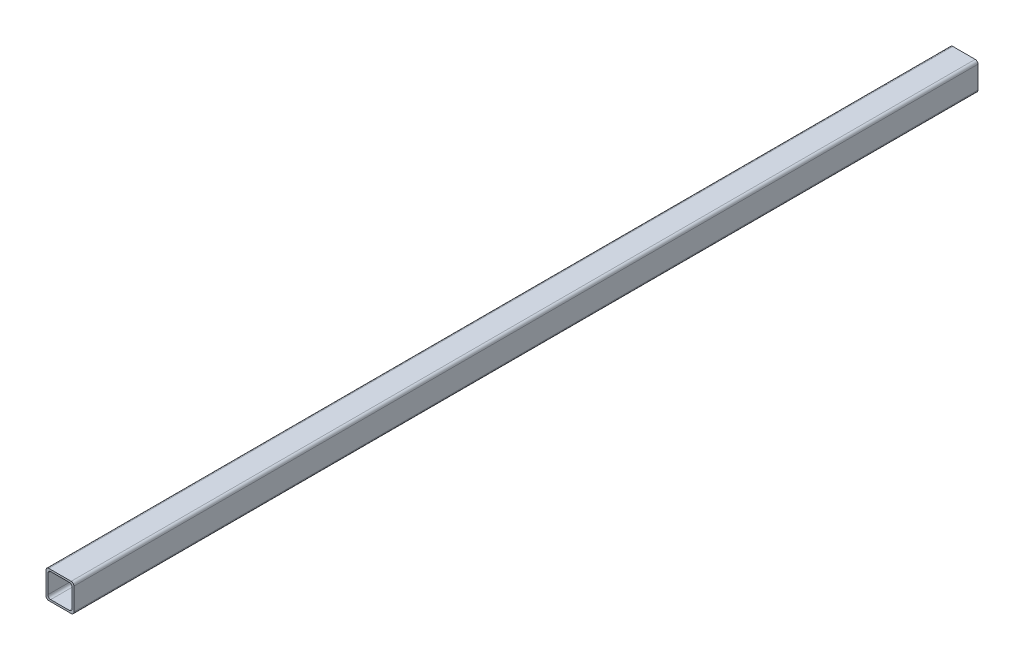
ISO-10303-21;
HEADER;
FILE_DESCRIPTION(('STEP AP214'),'2;1');
FILE_NAME('part.step','',(''),(''),'','','');
FILE_SCHEMA(('AUTOMOTIVE_DESIGN { 1 0 10303 214 1 1 1 1 }'));
ENDSEC;
DATA;
#1=APPLICATION_CONTEXT('core data for automotive mechanical design processes');
#2=APPLICATION_PROTOCOL_DEFINITION('international standard','automotive_design',2000,#1);
#3=PRODUCT_CONTEXT('',#1,'mechanical');
#4=PRODUCT('Part','Part','',(#3));
#5=PRODUCT_RELATED_PRODUCT_CATEGORY('part','',(#4));
#6=PRODUCT_DEFINITION_FORMATION('','',#4);
#7=PRODUCT_DEFINITION_CONTEXT('part definition',#1,'design');
#8=PRODUCT_DEFINITION('design','',#6,#7);
#9=PRODUCT_DEFINITION_SHAPE('','',#8);
#10=(LENGTH_UNIT() NAMED_UNIT(*) SI_UNIT(.MILLI.,.METRE.));
#11=(NAMED_UNIT(*) PLANE_ANGLE_UNIT() SI_UNIT($,.RADIAN.));
#12=(NAMED_UNIT(*) SI_UNIT($,.STERADIAN.) SOLID_ANGLE_UNIT());
#13=UNCERTAINTY_MEASURE_WITH_UNIT(LENGTH_MEASURE(1.E-05),#10,'distance_accuracy_value','');
#14=(GEOMETRIC_REPRESENTATION_CONTEXT(3) GLOBAL_UNCERTAINTY_ASSIGNED_CONTEXT((#13)) GLOBAL_UNIT_ASSIGNED_CONTEXT((#10,
#11,#12)) REPRESENTATION_CONTEXT('',''));
#15=CARTESIAN_POINT('',(0.,0.,0.));
#16=DIRECTION('',(0.,0.,1.));
#17=DIRECTION('',(1.,0.,0.));
#18=AXIS2_PLACEMENT_3D('',#15,#16,#17);
#19=CARTESIAN_POINT('',(12.,-12.,-970.));
#20=DIRECTION('',(0.,0.,1.));
#21=DIRECTION('',(1.,0.,0.));
#22=AXIS2_PLACEMENT_3D('',#19,#20,#21);
#23=CYLINDRICAL_SURFACE('',#22,3.);
#24=CARTESIAN_POINT('',(12.,-12.,0.));
#25=DIRECTION('',(0.,0.,1.));
#26=DIRECTION('',(1.,0.,0.));
#27=AXIS2_PLACEMENT_3D('',#24,#25,#26);
#28=CIRCLE('',#27,3.);
#29=CARTESIAN_POINT('',(12.,-15.,0.));
#30=VERTEX_POINT('',#29);
#31=CARTESIAN_POINT('',(15.,-12.,0.));
#32=VERTEX_POINT('',#31);
#33=EDGE_CURVE('E203',#30,#32,#28,.T.);
#34=ORIENTED_EDGE('',*,*,#33,.F.);
#35=DIRECTION('',(0.,0.,1.));
#36=VECTOR('',#35,1.);
#37=CARTESIAN_POINT('',(12.,-15.,-970.));
#38=LINE('',#37,#36);
#39=CARTESIAN_POINT('',(12.,-15.,-970.));
#40=VERTEX_POINT('',#39);
#41=EDGE_CURVE('E11',#40,#30,#38,.T.);
#42=ORIENTED_EDGE('',*,*,#41,.F.);
#43=CARTESIAN_POINT('',(12.,-12.,-970.));
#44=DIRECTION('',(0.,0.,1.));
#45=DIRECTION('',(1.,0.,0.));
#46=AXIS2_PLACEMENT_3D('',#43,#44,#45);
#47=CIRCLE('',#46,3.);
#48=CARTESIAN_POINT('',(15.,-12.,-970.));
#49=VERTEX_POINT('',#48);
#50=EDGE_CURVE('E215',#40,#49,#47,.T.);
#51=ORIENTED_EDGE('',*,*,#50,.T.);
#52=DIRECTION('',(0.,0.,1.));
#53=VECTOR('',#52,1.);
#54=CARTESIAN_POINT('',(15.,-12.,-970.));
#55=LINE('',#54,#53);
#56=EDGE_CURVE('E36',#49,#32,#55,.T.);
#57=ORIENTED_EDGE('',*,*,#56,.T.);
#58=EDGE_LOOP('',(#34,#42,#51,#57));
#59=FACE_BOUND('',#58,.T.);
#60=ADVANCED_FACE('F33',(#59),#23,.T.);
#61=CARTESIAN_POINT('',(-12.,-15.,-970.));
#62=DIRECTION('',(0.,-1.,0.));
#63=DIRECTION('',(1.,0.,0.));
#64=AXIS2_PLACEMENT_3D('',#61,#62,#63);
#65=PLANE('',#64);
#66=DIRECTION('',(1.,0.,0.));
#67=VECTOR('',#66,1.);
#68=CARTESIAN_POINT('',(-12.,-15.,0.));
#69=LINE('',#68,#67);
#70=CARTESIAN_POINT('',(-12.,-15.,0.));
#71=VERTEX_POINT('',#70);
#72=EDGE_CURVE('E219',#71,#30,#69,.T.);
#73=ORIENTED_EDGE('',*,*,#72,.F.);
#74=DIRECTION('',(0.,0.,1.));
#75=VECTOR('',#74,1.);
#76=CARTESIAN_POINT('',(-12.,-15.,-970.));
#77=LINE('',#76,#75);
#78=CARTESIAN_POINT('',(-12.,-15.,-970.));
#79=VERTEX_POINT('',#78);
#80=EDGE_CURVE('E41',#79,#71,#77,.T.);
#81=ORIENTED_EDGE('',*,*,#80,.F.);
#82=DIRECTION('',(1.,0.,0.));
#83=VECTOR('',#82,1.);
#84=CARTESIAN_POINT('',(-12.,-15.,-970.));
#85=LINE('',#84,#83);
#86=EDGE_CURVE('E237',#79,#40,#85,.T.);
#87=ORIENTED_EDGE('',*,*,#86,.T.);
#88=ORIENTED_EDGE('',*,*,#41,.T.);
#89=EDGE_LOOP('',(#73,#81,#87,#88));
#90=FACE_BOUND('',#89,.T.);
#91=ADVANCED_FACE('F284',(#90),#65,.T.);
#92=CARTESIAN_POINT('',(-12.,-12.,-970.));
#93=DIRECTION('',(0.,0.,1.));
#94=DIRECTION('',(1.,0.,0.));
#95=AXIS2_PLACEMENT_3D('',#92,#93,#94);
#96=CYLINDRICAL_SURFACE('',#95,3.);
#97=CARTESIAN_POINT('',(-12.,-12.,0.));
#98=DIRECTION('',(0.,0.,1.));
#99=DIRECTION('',(-1.,0.,0.));
#100=AXIS2_PLACEMENT_3D('',#97,#98,#99);
#101=CIRCLE('',#100,3.);
#102=CARTESIAN_POINT('',(-15.,-12.,0.));
#103=VERTEX_POINT('',#102);
#104=EDGE_CURVE('E257',#103,#71,#101,.T.);
#105=ORIENTED_EDGE('',*,*,#104,.F.);
#106=DIRECTION('',(0.,0.,1.));
#107=VECTOR('',#106,1.);
#108=CARTESIAN_POINT('',(-15.,-12.,-970.));
#109=LINE('',#108,#107);
#110=CARTESIAN_POINT('',(-15.,-12.,-970.));
#111=VERTEX_POINT('',#110);
#112=EDGE_CURVE('E263',#111,#103,#109,.T.);
#113=ORIENTED_EDGE('',*,*,#112,.F.);
#114=CARTESIAN_POINT('',(-12.,-12.,-970.));
#115=DIRECTION('',(0.,0.,1.));
#116=DIRECTION('',(-1.,0.,0.));
#117=AXIS2_PLACEMENT_3D('',#114,#115,#116);
#118=CIRCLE('',#117,3.);
#119=EDGE_CURVE('E234',#111,#79,#118,.T.);
#120=ORIENTED_EDGE('',*,*,#119,.T.);
#121=ORIENTED_EDGE('',*,*,#80,.T.);
#122=EDGE_LOOP('',(#105,#113,#120,#121));
#123=FACE_BOUND('',#122,.T.);
#124=ADVANCED_FACE('F303',(#123),#96,.T.);
#125=CARTESIAN_POINT('',(-15.,-12.,-970.));
#126=DIRECTION('',(-1.,0.,0.));
#127=DIRECTION('',(0.,-1.,0.));
#128=AXIS2_PLACEMENT_3D('',#125,#126,#127);
#129=PLANE('',#128);
#130=DIRECTION('',(0.,-1.,0.));
#131=VECTOR('',#130,1.);
#132=CARTESIAN_POINT('',(-15.,-12.,0.));
#133=LINE('',#132,#131);
#134=CARTESIAN_POINT('',(-15.,12.,0.));
#135=VERTEX_POINT('',#134);
#136=EDGE_CURVE('E254',#135,#103,#133,.T.);
#137=ORIENTED_EDGE('',*,*,#136,.F.);
#138=DIRECTION('',(0.,0.,1.));
#139=VECTOR('',#138,1.);
#140=CARTESIAN_POINT('',(-15.,12.,-970.));
#141=LINE('',#140,#139);
#142=CARTESIAN_POINT('',(-15.,12.,-970.));
#143=VERTEX_POINT('',#142);
#144=EDGE_CURVE('E265',#143,#135,#141,.T.);
#145=ORIENTED_EDGE('',*,*,#144,.F.);
#146=DIRECTION('',(0.,-1.,0.));
#147=VECTOR('',#146,1.);
#148=CARTESIAN_POINT('',(-15.,-12.,-970.));
#149=LINE('',#148,#147);
#150=EDGE_CURVE('E231',#143,#111,#149,.T.);
#151=ORIENTED_EDGE('',*,*,#150,.T.);
#152=ORIENTED_EDGE('',*,*,#112,.T.);
#153=EDGE_LOOP('',(#137,#145,#151,#152));
#154=FACE_BOUND('',#153,.T.);
#155=ADVANCED_FACE('F301',(#154),#129,.T.);
#156=CARTESIAN_POINT('',(-12.,12.,-970.));
#157=DIRECTION('',(0.,0.,1.));
#158=DIRECTION('',(1.,0.,0.));
#159=AXIS2_PLACEMENT_3D('',#156,#157,#158);
#160=CYLINDRICAL_SURFACE('',#159,3.);
#161=CARTESIAN_POINT('',(-12.,12.,0.));
#162=DIRECTION('',(0.,0.,1.));
#163=DIRECTION('',(-1.,0.,0.));
#164=AXIS2_PLACEMENT_3D('',#161,#162,#163);
#165=CIRCLE('',#164,3.);
#166=CARTESIAN_POINT('',(-12.,15.,0.));
#167=VERTEX_POINT('',#166);
#168=EDGE_CURVE('E251',#167,#135,#165,.T.);
#169=ORIENTED_EDGE('',*,*,#168,.F.);
#170=DIRECTION('',(0.,0.,1.));
#171=VECTOR('',#170,1.);
#172=CARTESIAN_POINT('',(-12.,15.,-970.));
#173=LINE('',#172,#171);
#174=CARTESIAN_POINT('',(-12.,15.,-970.));
#175=VERTEX_POINT('',#174);
#176=EDGE_CURVE('E267',#175,#167,#173,.T.);
#177=ORIENTED_EDGE('',*,*,#176,.F.);
#178=CARTESIAN_POINT('',(-12.,12.,-970.));
#179=DIRECTION('',(0.,0.,1.));
#180=DIRECTION('',(-1.,0.,0.));
#181=AXIS2_PLACEMENT_3D('',#178,#179,#180);
#182=CIRCLE('',#181,3.);
#183=EDGE_CURVE('E228',#175,#143,#182,.T.);
#184=ORIENTED_EDGE('',*,*,#183,.T.);
#185=ORIENTED_EDGE('',*,*,#144,.T.);
#186=EDGE_LOOP('',(#169,#177,#184,#185));
#187=FACE_BOUND('',#186,.T.);
#188=ADVANCED_FACE('F297',(#187),#160,.T.);
#189=CARTESIAN_POINT('',(-12.,15.,-970.));
#190=DIRECTION('',(0.,1.,0.));
#191=DIRECTION('',(-1.,0.,0.));
#192=AXIS2_PLACEMENT_3D('',#189,#190,#191);
#193=PLANE('',#192);
#194=DIRECTION('',(-1.,0.,0.));
#195=VECTOR('',#194,1.);
#196=CARTESIAN_POINT('',(-12.,15.,0.));
#197=LINE('',#196,#195);
#198=CARTESIAN_POINT('',(12.,15.,0.));
#199=VERTEX_POINT('',#198);
#200=EDGE_CURVE('E248',#199,#167,#197,.T.);
#201=ORIENTED_EDGE('',*,*,#200,.F.);
#202=DIRECTION('',(0.,0.,1.));
#203=VECTOR('',#202,1.);
#204=CARTESIAN_POINT('',(12.,15.,-970.));
#205=LINE('',#204,#203);
#206=CARTESIAN_POINT('',(12.,15.,-970.));
#207=VERTEX_POINT('',#206);
#208=EDGE_CURVE('E269',#207,#199,#205,.T.);
#209=ORIENTED_EDGE('',*,*,#208,.F.);
#210=DIRECTION('',(-1.,0.,0.));
#211=VECTOR('',#210,1.);
#212=CARTESIAN_POINT('',(-12.,15.,-970.));
#213=LINE('',#212,#211);
#214=EDGE_CURVE('E225',#207,#175,#213,.T.);
#215=ORIENTED_EDGE('',*,*,#214,.T.);
#216=ORIENTED_EDGE('',*,*,#176,.T.);
#217=EDGE_LOOP('',(#201,#209,#215,#216));
#218=FACE_BOUND('',#217,.T.);
#219=ADVANCED_FACE('F295',(#218),#193,.T.);
#220=CARTESIAN_POINT('',(12.,12.,-970.));
#221=DIRECTION('',(0.,0.,1.));
#222=DIRECTION('',(1.,0.,0.));
#223=AXIS2_PLACEMENT_3D('',#220,#221,#222);
#224=CYLINDRICAL_SURFACE('',#223,3.);
#225=CARTESIAN_POINT('',(12.,12.,0.));
#226=DIRECTION('',(0.,0.,1.));
#227=DIRECTION('',(-1.,0.,0.));
#228=AXIS2_PLACEMENT_3D('',#225,#226,#227);
#229=CIRCLE('',#228,3.);
#230=CARTESIAN_POINT('',(15.,12.,0.));
#231=VERTEX_POINT('',#230);
#232=EDGE_CURVE('E245',#231,#199,#229,.T.);
#233=ORIENTED_EDGE('',*,*,#232,.F.);
#234=DIRECTION('',(0.,0.,1.));
#235=VECTOR('',#234,1.);
#236=CARTESIAN_POINT('',(15.,12.,-970.));
#237=LINE('',#236,#235);
#238=CARTESIAN_POINT('',(15.,12.,-970.));
#239=VERTEX_POINT('',#238);
#240=EDGE_CURVE('E270',#239,#231,#237,.T.);
#241=ORIENTED_EDGE('',*,*,#240,.F.);
#242=CARTESIAN_POINT('',(12.,12.,-970.));
#243=DIRECTION('',(0.,0.,1.));
#244=DIRECTION('',(-1.,0.,0.));
#245=AXIS2_PLACEMENT_3D('',#242,#243,#244);
#246=CIRCLE('',#245,3.);
#247=EDGE_CURVE('E222',#239,#207,#246,.T.);
#248=ORIENTED_EDGE('',*,*,#247,.T.);
#249=ORIENTED_EDGE('',*,*,#208,.T.);
#250=EDGE_LOOP('',(#233,#241,#248,#249));
#251=FACE_BOUND('',#250,.T.);
#252=ADVANCED_FACE('F291',(#251),#224,.T.);
#253=CARTESIAN_POINT('',(15.,-12.,-970.));
#254=DIRECTION('',(1.,0.,0.));
#255=DIRECTION('',(0.,0.,-1.));
#256=AXIS2_PLACEMENT_3D('',#253,#254,#255);
#257=PLANE('',#256);
#258=DIRECTION('',(0.,1.,0.));
#259=VECTOR('',#258,1.);
#260=CARTESIAN_POINT('',(15.,-12.,0.));
#261=LINE('',#260,#259);
#262=EDGE_CURVE('E242',#32,#231,#261,.T.);
#263=ORIENTED_EDGE('',*,*,#262,.F.);
#264=ORIENTED_EDGE('',*,*,#56,.F.);
#265=DIRECTION('',(0.,1.,0.));
#266=VECTOR('',#265,1.);
#267=CARTESIAN_POINT('',(15.,-12.,-970.));
#268=LINE('',#267,#266);
#269=EDGE_CURVE('E218',#49,#239,#268,.T.);
#270=ORIENTED_EDGE('',*,*,#269,.T.);
#271=ORIENTED_EDGE('',*,*,#240,.T.);
#272=EDGE_LOOP('',(#263,#264,#270,#271));
#273=FACE_BOUND('',#272,.T.);
#274=ADVANCED_FACE('F278',(#273),#257,.T.);
#275=CARTESIAN_POINT('',(12.,-12.,-970.));
#276=DIRECTION('',(0.,0.,1.));
#277=DIRECTION('',(1.,0.,0.));
#278=AXIS2_PLACEMENT_3D('',#275,#276,#277);
#279=PLANE('',#278);
#280=DIRECTION('',(1.,0.,0.));
#281=VECTOR('',#280,1.);
#282=CARTESIAN_POINT('',(-9.99999999999997,-13.,-970.));
#283=LINE('',#282,#281);
#284=CARTESIAN_POINT('',(-9.99999999999997,-13.,-970.));
#285=VERTEX_POINT('',#284);
#286=CARTESIAN_POINT('',(9.99999999999997,-13.,-970.));
#287=VERTEX_POINT('',#286);
#288=EDGE_CURVE('E154',#285,#287,#283,.T.);
#289=ORIENTED_EDGE('',*,*,#288,.T.);
#290=CARTESIAN_POINT('',(9.99999999999999,-9.99999999999999,-970.));
#291=DIRECTION('',(0.,0.,1.));
#292=DIRECTION('',(1.,0.,0.));
#293=AXIS2_PLACEMENT_3D('',#290,#291,#292);
#294=CIRCLE('',#293,3.);
#295=CARTESIAN_POINT('',(13.,-9.99999999999997,-970.));
#296=VERTEX_POINT('',#295);
#297=EDGE_CURVE('E148',#287,#296,#294,.T.);
#298=ORIENTED_EDGE('',*,*,#297,.T.);
#299=DIRECTION('',(0.,1.,0.));
#300=VECTOR('',#299,1.);
#301=CARTESIAN_POINT('',(13.,-9.99999999999997,-970.));
#302=LINE('',#301,#300);
#303=CARTESIAN_POINT('',(13.,9.99999999999997,-970.));
#304=VERTEX_POINT('',#303);
#305=EDGE_CURVE('E157',#296,#304,#302,.T.);
#306=ORIENTED_EDGE('',*,*,#305,.T.);
#307=CARTESIAN_POINT('',(9.99999999999999,9.99999999999999,-970.));
#308=DIRECTION('',(0.,0.,1.));
#309=DIRECTION('',(-1.,0.,0.));
#310=AXIS2_PLACEMENT_3D('',#307,#308,#309);
#311=CIRCLE('',#310,3.);
#312=CARTESIAN_POINT('',(9.99999999999997,13.,-970.));
#313=VERTEX_POINT('',#312);
#314=EDGE_CURVE('E49',#304,#313,#311,.T.);
#315=ORIENTED_EDGE('',*,*,#314,.T.);
#316=DIRECTION('',(-1.,0.,0.));
#317=VECTOR('',#316,1.);
#318=CARTESIAN_POINT('',(-9.99999999999998,13.,-970.));
#319=LINE('',#318,#317);
#320=CARTESIAN_POINT('',(-9.99999999999998,13.,-970.));
#321=VERTEX_POINT('',#320);
#322=EDGE_CURVE('E172',#313,#321,#319,.T.);
#323=ORIENTED_EDGE('',*,*,#322,.T.);
#324=CARTESIAN_POINT('',(-10.,9.99999999999999,-970.));
#325=DIRECTION('',(0.,0.,1.));
#326=DIRECTION('',(-1.,0.,0.));
#327=AXIS2_PLACEMENT_3D('',#324,#325,#326);
#328=CIRCLE('',#327,3.);
#329=CARTESIAN_POINT('',(-13.,9.99999999999996,-970.));
#330=VERTEX_POINT('',#329);
#331=EDGE_CURVE('E175',#321,#330,#328,.T.);
#332=ORIENTED_EDGE('',*,*,#331,.T.);
#333=DIRECTION('',(0.,-1.,0.));
#334=VECTOR('',#333,1.);
#335=CARTESIAN_POINT('',(-13.,-9.99999999999998,-970.));
#336=LINE('',#335,#334);
#337=CARTESIAN_POINT('',(-13.,-10.,-970.));
#338=VERTEX_POINT('',#337);
#339=EDGE_CURVE('E178',#330,#338,#336,.T.);
#340=ORIENTED_EDGE('',*,*,#339,.T.);
#341=CARTESIAN_POINT('',(-9.99999999999999,-10.,-970.));
#342=DIRECTION('',(0.,0.,1.));
#343=DIRECTION('',(-1.,0.,0.));
#344=AXIS2_PLACEMENT_3D('',#341,#342,#343);
#345=CIRCLE('',#344,3.);
#346=EDGE_CURVE('E181',#338,#285,#345,.T.);
#347=ORIENTED_EDGE('',*,*,#346,.T.);
#348=EDGE_LOOP('',(#289,#298,#306,#315,#323,#332,#340,#347));
#349=FACE_BOUND('',#348,.T.);
#350=ORIENTED_EDGE('',*,*,#50,.F.);
#351=ORIENTED_EDGE('',*,*,#86,.F.);
#352=ORIENTED_EDGE('',*,*,#119,.F.);
#353=ORIENTED_EDGE('',*,*,#150,.F.);
#354=ORIENTED_EDGE('',*,*,#183,.F.);
#355=ORIENTED_EDGE('',*,*,#214,.F.);
#356=ORIENTED_EDGE('',*,*,#247,.F.);
#357=ORIENTED_EDGE('',*,*,#269,.F.);
#358=EDGE_LOOP('',(#350,#351,#352,#353,#354,#355,#356,#357));
#359=FACE_BOUND('',#358,.T.);
#360=ADVANCED_FACE('F161',(#349,#359),#279,.F.);
#361=CARTESIAN_POINT('',(12.,-12.,0.));
#362=DIRECTION('',(0.,0.,1.));
#363=DIRECTION('',(1.,0.,0.));
#364=AXIS2_PLACEMENT_3D('',#361,#362,#363);
#365=PLANE('',#364);
#366=CARTESIAN_POINT('',(9.99999999999999,-9.99999999999999,0.));
#367=DIRECTION('',(0.,0.,1.));
#368=DIRECTION('',(1.,0.,0.));
#369=AXIS2_PLACEMENT_3D('',#366,#367,#368);
#370=CIRCLE('',#369,3.);
#371=CARTESIAN_POINT('',(9.99999999999997,-13.,0.));
#372=VERTEX_POINT('',#371);
#373=CARTESIAN_POINT('',(13.,-9.99999999999997,0.));
#374=VERTEX_POINT('',#373);
#375=EDGE_CURVE('E57',#372,#374,#370,.T.);
#376=ORIENTED_EDGE('',*,*,#375,.F.);
#377=DIRECTION('',(1.,0.,0.));
#378=VECTOR('',#377,1.);
#379=CARTESIAN_POINT('',(-9.99999999999997,-13.,0.));
#380=LINE('',#379,#378);
#381=CARTESIAN_POINT('',(-9.99999999999997,-13.,0.));
#382=VERTEX_POINT('',#381);
#383=EDGE_CURVE('E165',#382,#372,#380,.T.);
#384=ORIENTED_EDGE('',*,*,#383,.F.);
#385=CARTESIAN_POINT('',(-9.99999999999999,-10.,0.));
#386=DIRECTION('',(0.,0.,1.));
#387=DIRECTION('',(-1.,0.,0.));
#388=AXIS2_PLACEMENT_3D('',#385,#386,#387);
#389=CIRCLE('',#388,3.);
#390=CARTESIAN_POINT('',(-13.,-10.,0.));
#391=VERTEX_POINT('',#390);
#392=EDGE_CURVE('E168',#391,#382,#389,.T.);
#393=ORIENTED_EDGE('',*,*,#392,.F.);
#394=DIRECTION('',(0.,-1.,0.));
#395=VECTOR('',#394,1.);
#396=CARTESIAN_POINT('',(-13.,-9.99999999999998,0.));
#397=LINE('',#396,#395);
#398=CARTESIAN_POINT('',(-13.,9.99999999999996,0.));
#399=VERTEX_POINT('',#398);
#400=EDGE_CURVE('E196',#399,#391,#397,.T.);
#401=ORIENTED_EDGE('',*,*,#400,.F.);
#402=CARTESIAN_POINT('',(-10.,9.99999999999999,0.));
#403=DIRECTION('',(0.,0.,1.));
#404=DIRECTION('',(-1.,0.,0.));
#405=AXIS2_PLACEMENT_3D('',#402,#403,#404);
#406=CIRCLE('',#405,3.);
#407=CARTESIAN_POINT('',(-9.99999999999998,13.,0.));
#408=VERTEX_POINT('',#407);
#409=EDGE_CURVE('E193',#408,#399,#406,.T.);
#410=ORIENTED_EDGE('',*,*,#409,.F.);
#411=DIRECTION('',(-1.,0.,0.));
#412=VECTOR('',#411,1.);
#413=CARTESIAN_POINT('',(-9.99999999999998,13.,0.));
#414=LINE('',#413,#412);
#415=CARTESIAN_POINT('',(9.99999999999997,13.,0.));
#416=VERTEX_POINT('',#415);
#417=EDGE_CURVE('E190',#416,#408,#414,.T.);
#418=ORIENTED_EDGE('',*,*,#417,.F.);
#419=CARTESIAN_POINT('',(9.99999999999999,9.99999999999999,0.));
#420=DIRECTION('',(0.,0.,1.));
#421=DIRECTION('',(-1.,0.,0.));
#422=AXIS2_PLACEMENT_3D('',#419,#420,#421);
#423=CIRCLE('',#422,3.);
#424=CARTESIAN_POINT('',(13.,9.99999999999997,0.));
#425=VERTEX_POINT('',#424);
#426=EDGE_CURVE('E187',#425,#416,#423,.T.);
#427=ORIENTED_EDGE('',*,*,#426,.F.);
#428=DIRECTION('',(0.,1.,0.));
#429=VECTOR('',#428,1.);
#430=CARTESIAN_POINT('',(13.,-9.99999999999997,0.));
#431=LINE('',#430,#429);
#432=EDGE_CURVE('E185',#374,#425,#431,.T.);
#433=ORIENTED_EDGE('',*,*,#432,.F.);
#434=EDGE_LOOP('',(#376,#384,#393,#401,#410,#418,#427,#433));
#435=FACE_BOUND('',#434,.T.);
#436=ORIENTED_EDGE('',*,*,#33,.T.);
#437=ORIENTED_EDGE('',*,*,#262,.T.);
#438=ORIENTED_EDGE('',*,*,#232,.T.);
#439=ORIENTED_EDGE('',*,*,#200,.T.);
#440=ORIENTED_EDGE('',*,*,#168,.T.);
#441=ORIENTED_EDGE('',*,*,#136,.T.);
#442=ORIENTED_EDGE('',*,*,#104,.T.);
#443=ORIENTED_EDGE('',*,*,#72,.T.);
#444=EDGE_LOOP('',(#436,#437,#438,#439,#440,#441,#442,#443));
#445=FACE_BOUND('',#444,.T.);
#446=ADVANCED_FACE('F280',(#435,#445),#365,.T.);
#447=CARTESIAN_POINT('',(9.99999999999999,-9.99999999999999,-970.));
#448=DIRECTION('',(0.,0.,1.));
#449=DIRECTION('',(1.,0.,0.));
#450=AXIS2_PLACEMENT_3D('',#447,#448,#449);
#451=CYLINDRICAL_SURFACE('',#450,3.);
#452=ORIENTED_EDGE('',*,*,#375,.T.);
#453=DIRECTION('',(0.,0.,1.));
#454=VECTOR('',#453,1.);
#455=CARTESIAN_POINT('',(13.,-9.99999999999997,-970.));
#456=LINE('',#455,#454);
#457=EDGE_CURVE('E144',#296,#374,#456,.T.);
#458=ORIENTED_EDGE('',*,*,#457,.F.);
#459=ORIENTED_EDGE('',*,*,#297,.F.);
#460=DIRECTION('',(0.,0.,1.));
#461=VECTOR('',#460,1.);
#462=CARTESIAN_POINT('',(9.99999999999997,-13.,-970.));
#463=LINE('',#462,#461);
#464=EDGE_CURVE('E201',#287,#372,#463,.T.);
#465=ORIENTED_EDGE('',*,*,#464,.T.);
#466=EDGE_LOOP('',(#452,#458,#459,#465));
#467=FACE_BOUND('',#466,.T.);
#468=ADVANCED_FACE('F146',(#467),#451,.F.);
#469=CARTESIAN_POINT('',(-9.99999999999997,-13.,-970.));
#470=DIRECTION('',(0.,-1.,0.));
#471=DIRECTION('',(1.,0.,0.));
#472=AXIS2_PLACEMENT_3D('',#469,#470,#471);
#473=PLANE('',#472);
#474=ORIENTED_EDGE('',*,*,#383,.T.);
#475=ORIENTED_EDGE('',*,*,#464,.F.);
#476=ORIENTED_EDGE('',*,*,#288,.F.);
#477=DIRECTION('',(0.,0.,1.));
#478=VECTOR('',#477,1.);
#479=CARTESIAN_POINT('',(-9.99999999999997,-13.,-970.));
#480=LINE('',#479,#478);
#481=EDGE_CURVE('E204',#285,#382,#480,.T.);
#482=ORIENTED_EDGE('',*,*,#481,.T.);
#483=EDGE_LOOP('',(#474,#475,#476,#482));
#484=FACE_BOUND('',#483,.T.);
#485=ADVANCED_FACE('F386',(#484),#473,.F.);
#486=CARTESIAN_POINT('',(-9.99999999999999,-10.,-970.));
#487=DIRECTION('',(0.,0.,1.));
#488=DIRECTION('',(1.,0.,0.));
#489=AXIS2_PLACEMENT_3D('',#486,#487,#488);
#490=CYLINDRICAL_SURFACE('',#489,3.);
#491=ORIENTED_EDGE('',*,*,#392,.T.);
#492=ORIENTED_EDGE('',*,*,#481,.F.);
#493=ORIENTED_EDGE('',*,*,#346,.F.);
#494=DIRECTION('',(0.,0.,1.));
#495=VECTOR('',#494,1.);
#496=CARTESIAN_POINT('',(-13.,-10.,-970.));
#497=LINE('',#496,#495);
#498=EDGE_CURVE('E206',#338,#391,#497,.T.);
#499=ORIENTED_EDGE('',*,*,#498,.T.);
#500=EDGE_LOOP('',(#491,#492,#493,#499));
#501=FACE_BOUND('',#500,.T.);
#502=ADVANCED_FACE('F395',(#501),#490,.F.);
#503=CARTESIAN_POINT('',(-13.,-9.99999999999998,-970.));
#504=DIRECTION('',(-1.,0.,0.));
#505=DIRECTION('',(0.,-1.,0.));
#506=AXIS2_PLACEMENT_3D('',#503,#504,#505);
#507=PLANE('',#506);
#508=ORIENTED_EDGE('',*,*,#400,.T.);
#509=ORIENTED_EDGE('',*,*,#498,.F.);
#510=ORIENTED_EDGE('',*,*,#339,.F.);
#511=DIRECTION('',(0.,0.,1.));
#512=VECTOR('',#511,1.);
#513=CARTESIAN_POINT('',(-13.,9.99999999999996,-970.));
#514=LINE('',#513,#512);
#515=EDGE_CURVE('E208',#330,#399,#514,.T.);
#516=ORIENTED_EDGE('',*,*,#515,.T.);
#517=EDGE_LOOP('',(#508,#509,#510,#516));
#518=FACE_BOUND('',#517,.T.);
#519=ADVANCED_FACE('F405',(#518),#507,.F.);
#520=CARTESIAN_POINT('',(-10.,9.99999999999999,-970.));
#521=DIRECTION('',(0.,0.,1.));
#522=DIRECTION('',(1.,0.,0.));
#523=AXIS2_PLACEMENT_3D('',#520,#521,#522);
#524=CYLINDRICAL_SURFACE('',#523,3.);
#525=ORIENTED_EDGE('',*,*,#409,.T.);
#526=ORIENTED_EDGE('',*,*,#515,.F.);
#527=ORIENTED_EDGE('',*,*,#331,.F.);
#528=DIRECTION('',(0.,0.,1.));
#529=VECTOR('',#528,1.);
#530=CARTESIAN_POINT('',(-9.99999999999998,13.,-970.));
#531=LINE('',#530,#529);
#532=EDGE_CURVE('E210',#321,#408,#531,.T.);
#533=ORIENTED_EDGE('',*,*,#532,.T.);
#534=EDGE_LOOP('',(#525,#526,#527,#533));
#535=FACE_BOUND('',#534,.T.);
#536=ADVANCED_FACE('F415',(#535),#524,.F.);
#537=CARTESIAN_POINT('',(-9.99999999999998,13.,-970.));
#538=DIRECTION('',(0.,1.,0.));
#539=DIRECTION('',(-1.,0.,0.));
#540=AXIS2_PLACEMENT_3D('',#537,#538,#539);
#541=PLANE('',#540);
#542=ORIENTED_EDGE('',*,*,#417,.T.);
#543=ORIENTED_EDGE('',*,*,#532,.F.);
#544=ORIENTED_EDGE('',*,*,#322,.F.);
#545=DIRECTION('',(0.,0.,1.));
#546=VECTOR('',#545,1.);
#547=CARTESIAN_POINT('',(9.99999999999997,13.,-970.));
#548=LINE('',#547,#546);
#549=EDGE_CURVE('E212',#313,#416,#548,.T.);
#550=ORIENTED_EDGE('',*,*,#549,.T.);
#551=EDGE_LOOP('',(#542,#543,#544,#550));
#552=FACE_BOUND('',#551,.T.);
#553=ADVANCED_FACE('F425',(#552),#541,.F.);
#554=CARTESIAN_POINT('',(9.99999999999999,9.99999999999999,-970.));
#555=DIRECTION('',(0.,0.,1.));
#556=DIRECTION('',(1.,0.,0.));
#557=AXIS2_PLACEMENT_3D('',#554,#555,#556);
#558=CYLINDRICAL_SURFACE('',#557,3.);
#559=ORIENTED_EDGE('',*,*,#426,.T.);
#560=ORIENTED_EDGE('',*,*,#549,.F.);
#561=ORIENTED_EDGE('',*,*,#314,.F.);
#562=DIRECTION('',(0.,0.,1.));
#563=VECTOR('',#562,1.);
#564=CARTESIAN_POINT('',(13.,9.99999999999997,-970.));
#565=LINE('',#564,#563);
#566=EDGE_CURVE('E153',#304,#425,#565,.T.);
#567=ORIENTED_EDGE('',*,*,#566,.T.);
#568=EDGE_LOOP('',(#559,#560,#561,#567));
#569=FACE_BOUND('',#568,.T.);
#570=ADVANCED_FACE('F435',(#569),#558,.F.);
#571=CARTESIAN_POINT('',(13.,-9.99999999999997,-970.));
#572=DIRECTION('',(1.,0.,0.));
#573=DIRECTION('',(0.,0.,-1.));
#574=AXIS2_PLACEMENT_3D('',#571,#572,#573);
#575=PLANE('',#574);
#576=ORIENTED_EDGE('',*,*,#432,.T.);
#577=ORIENTED_EDGE('',*,*,#566,.F.);
#578=ORIENTED_EDGE('',*,*,#305,.F.);
#579=ORIENTED_EDGE('',*,*,#457,.T.);
#580=EDGE_LOOP('',(#576,#577,#578,#579));
#581=FACE_BOUND('',#580,.T.);
#582=ADVANCED_FACE('F158',(#581),#575,.F.);
#583=CLOSED_SHELL('',(#60,#91,#124,#155,#188,#219,#252,#274,#360,#446,#468,#485,#502,#519,#536,
#553,#570,#582));
#584=MANIFOLD_SOLID_BREP('B2',#583);
#585=ADVANCED_BREP_SHAPE_REPRESENTATION('',(#18,#584),#14);
#586=SHAPE_DEFINITION_REPRESENTATION(#9,#585);
ENDSEC;
END-ISO-10303-21;
